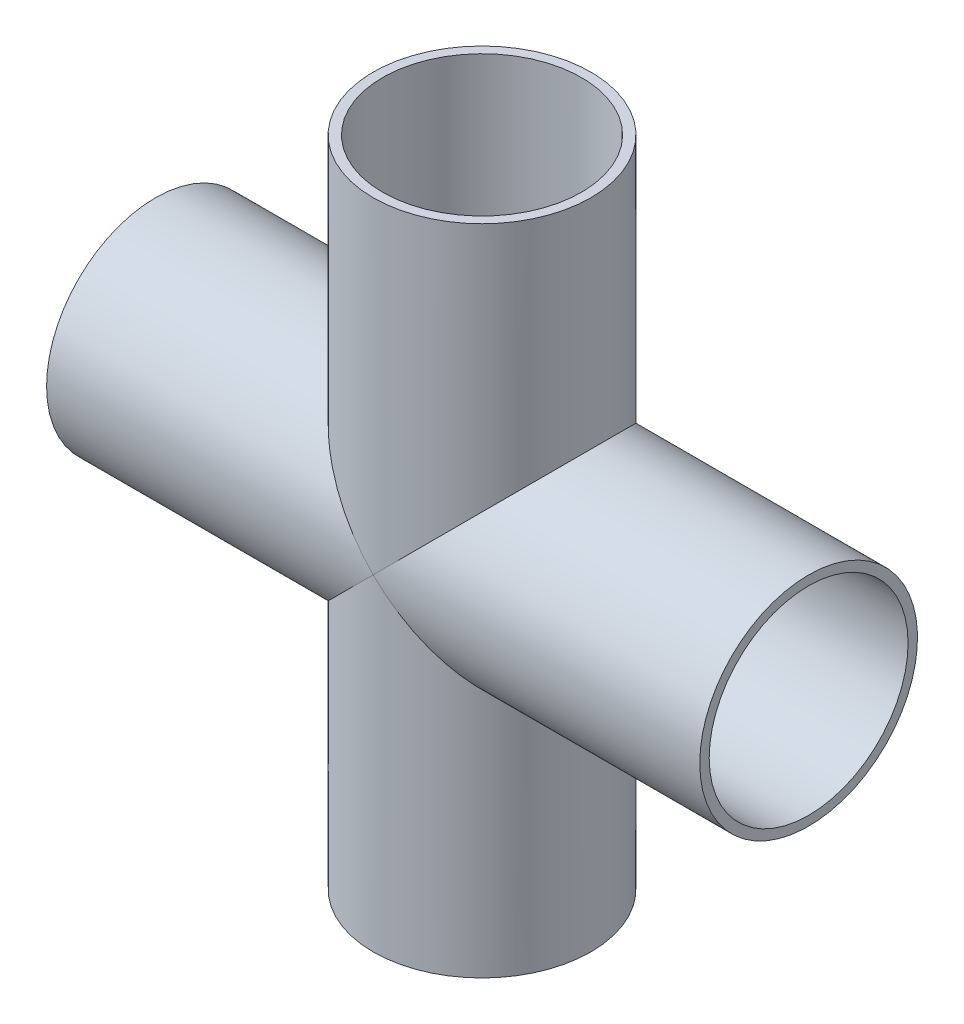
ISO-10303-21;
HEADER;
FILE_DESCRIPTION(('STEP AP214'),'2;1');
FILE_NAME('part.step','',(''),(''),'','','');
FILE_SCHEMA(('AUTOMOTIVE_DESIGN { 1 0 10303 214 1 1 1 1 }'));
ENDSEC;
DATA;
#1=APPLICATION_CONTEXT('core data for automotive mechanical design processes');
#2=APPLICATION_PROTOCOL_DEFINITION('international standard','automotive_design',2000,#1);
#3=PRODUCT_CONTEXT('',#1,'mechanical');
#4=PRODUCT('Part','Part','',(#3));
#5=PRODUCT_RELATED_PRODUCT_CATEGORY('part','',(#4));
#6=PRODUCT_DEFINITION_FORMATION('','',#4);
#7=PRODUCT_DEFINITION_CONTEXT('part definition',#1,'design');
#8=PRODUCT_DEFINITION('design','',#6,#7);
#9=PRODUCT_DEFINITION_SHAPE('','',#8);
#10=(LENGTH_UNIT() NAMED_UNIT(*) SI_UNIT(.MILLI.,.METRE.));
#11=(NAMED_UNIT(*) PLANE_ANGLE_UNIT() SI_UNIT($,.RADIAN.));
#12=(NAMED_UNIT(*) SI_UNIT($,.STERADIAN.) SOLID_ANGLE_UNIT());
#13=UNCERTAINTY_MEASURE_WITH_UNIT(LENGTH_MEASURE(1.E-05),#10,'distance_accuracy_value','');
#14=(GEOMETRIC_REPRESENTATION_CONTEXT(3) GLOBAL_UNCERTAINTY_ASSIGNED_CONTEXT((#13)) GLOBAL_UNIT_ASSIGNED_CONTEXT((#10,
#11,#12)) REPRESENTATION_CONTEXT('',''));
#15=CARTESIAN_POINT('',(0.,0.,0.));
#16=DIRECTION('',(0.,0.,1.));
#17=DIRECTION('',(1.,0.,0.));
#18=AXIS2_PLACEMENT_3D('',#15,#16,#17);
#19=CARTESIAN_POINT('',(0.,-57.15,0.));
#20=DIRECTION('',(0.,1.,0.));
#21=DIRECTION('',(1.,0.,0.));
#22=AXIS2_PLACEMENT_3D('',#19,#20,#21);
#23=PLANE('',#22);
#24=CARTESIAN_POINT('',(0.,-57.15,0.));
#25=DIRECTION('',(0.,1.,0.));
#26=DIRECTION('',(0.,0.,1.));
#27=AXIS2_PLACEMENT_3D('',#24,#25,#26);
#28=CIRCLE('',#27,17.399);
#29=CARTESIAN_POINT('',(0.,-57.15,17.399));
#30=VERTEX_POINT('',#29);
#31=EDGE_CURVE('E112',#30,#30,#28,.T.);
#32=ORIENTED_EDGE('',*,*,#31,.T.);
#33=EDGE_LOOP('',(#32));
#34=FACE_BOUND('',#33,.T.);
#35=CARTESIAN_POINT('',(0.,-57.15,0.));
#36=DIRECTION('',(0.,1.,0.));
#37=DIRECTION('',(1.,0.,0.));
#38=AXIS2_PLACEMENT_3D('',#35,#36,#37);
#39=CIRCLE('',#38,19.05);
#40=CARTESIAN_POINT('',(19.05,-57.15,0.));
#41=VERTEX_POINT('',#40);
#42=EDGE_CURVE('E136',#41,#41,#39,.T.);
#43=ORIENTED_EDGE('',*,*,#42,.F.);
#44=EDGE_LOOP('',(#43));
#45=FACE_BOUND('',#44,.T.);
#46=ADVANCED_FACE('F16',(#34,#45),#23,.F.);
#47=CARTESIAN_POINT('',(57.15,0.,0.));
#48=DIRECTION('',(-1.,0.,0.));
#49=DIRECTION('',(0.,0.,1.));
#50=AXIS2_PLACEMENT_3D('',#47,#48,#49);
#51=PLANE('',#50);
#52=CARTESIAN_POINT('',(57.15,0.,0.));
#53=DIRECTION('',(-1.,0.,0.));
#54=DIRECTION('',(0.,-1.,0.));
#55=AXIS2_PLACEMENT_3D('',#52,#53,#54);
#56=CIRCLE('',#55,17.399);
#57=CARTESIAN_POINT('',(57.15,-17.399,0.));
#58=VERTEX_POINT('',#57);
#59=EDGE_CURVE('E49',#58,#58,#56,.T.);
#60=ORIENTED_EDGE('',*,*,#59,.T.);
#61=EDGE_LOOP('',(#60));
#62=FACE_BOUND('',#61,.T.);
#63=CARTESIAN_POINT('',(57.15,0.,0.));
#64=DIRECTION('',(-1.,0.,0.));
#65=DIRECTION('',(0.,1.,0.));
#66=AXIS2_PLACEMENT_3D('',#63,#64,#65);
#67=CIRCLE('',#66,19.05);
#68=CARTESIAN_POINT('',(57.15,19.05,0.));
#69=VERTEX_POINT('',#68);
#70=EDGE_CURVE('E89',#69,#69,#67,.T.);
#71=ORIENTED_EDGE('',*,*,#70,.F.);
#72=EDGE_LOOP('',(#71));
#73=FACE_BOUND('',#72,.T.);
#74=ADVANCED_FACE('F171',(#62,#73),#51,.F.);
#75=CARTESIAN_POINT('',(0.,57.15,0.));
#76=DIRECTION('',(0.,1.,0.));
#77=DIRECTION('',(1.,0.,0.));
#78=AXIS2_PLACEMENT_3D('',#75,#76,#77);
#79=PLANE('',#78);
#80=CARTESIAN_POINT('',(0.,57.15,0.));
#81=DIRECTION('',(0.,1.,0.));
#82=DIRECTION('',(0.,0.,1.));
#83=AXIS2_PLACEMENT_3D('',#80,#81,#82);
#84=CIRCLE('',#83,17.399);
#85=CARTESIAN_POINT('',(0.,57.15,17.399));
#86=VERTEX_POINT('',#85);
#87=EDGE_CURVE('E59',#86,#86,#84,.T.);
#88=ORIENTED_EDGE('',*,*,#87,.F.);
#89=EDGE_LOOP('',(#88));
#90=FACE_BOUND('',#89,.T.);
#91=CARTESIAN_POINT('',(0.,57.15,0.));
#92=DIRECTION('',(0.,1.,0.));
#93=DIRECTION('',(1.,0.,0.));
#94=AXIS2_PLACEMENT_3D('',#91,#92,#93);
#95=CIRCLE('',#94,19.05);
#96=CARTESIAN_POINT('',(19.05,57.15,0.));
#97=VERTEX_POINT('',#96);
#98=EDGE_CURVE('E117',#97,#97,#95,.T.);
#99=ORIENTED_EDGE('',*,*,#98,.T.);
#100=EDGE_LOOP('',(#99));
#101=FACE_BOUND('',#100,.T.);
#102=ADVANCED_FACE('F18',(#90,#101),#79,.T.);
#103=CARTESIAN_POINT('',(-57.15,0.,0.));
#104=DIRECTION('',(-1.,0.,0.));
#105=DIRECTION('',(0.,0.,1.));
#106=AXIS2_PLACEMENT_3D('',#103,#104,#105);
#107=PLANE('',#106);
#108=CARTESIAN_POINT('',(-57.15,0.,0.));
#109=DIRECTION('',(-1.,0.,0.));
#110=DIRECTION('',(0.,-1.,0.));
#111=AXIS2_PLACEMENT_3D('',#108,#109,#110);
#112=CIRCLE('',#111,17.399);
#113=CARTESIAN_POINT('',(-57.15,-17.399,0.));
#114=VERTEX_POINT('',#113);
#115=EDGE_CURVE('E118',#114,#114,#112,.T.);
#116=ORIENTED_EDGE('',*,*,#115,.F.);
#117=EDGE_LOOP('',(#116));
#118=FACE_BOUND('',#117,.T.);
#119=CARTESIAN_POINT('',(-57.15,0.,0.));
#120=DIRECTION('',(-1.,0.,0.));
#121=DIRECTION('',(0.,1.,0.));
#122=AXIS2_PLACEMENT_3D('',#119,#120,#121);
#123=CIRCLE('',#122,19.05);
#124=CARTESIAN_POINT('',(-57.15,19.05,0.));
#125=VERTEX_POINT('',#124);
#126=EDGE_CURVE('E11',#125,#125,#123,.T.);
#127=ORIENTED_EDGE('',*,*,#126,.T.);
#128=EDGE_LOOP('',(#127));
#129=FACE_BOUND('',#128,.T.);
#130=ADVANCED_FACE('F221',(#118,#129),#107,.T.);
#131=CARTESIAN_POINT('',(57.15,0.,0.));
#132=DIRECTION('',(1.,0.,0.));
#133=DIRECTION('',(0.,0.,1.));
#134=AXIS2_PLACEMENT_3D('',#131,#132,#133);
#135=CYLINDRICAL_SURFACE('',#134,19.05);
#136=CARTESIAN_POINT('',(0.,0.,0.));
#137=DIRECTION('',(0.707106781186548,-0.707106781186548,0.));
#138=DIRECTION('',(-0.707106781186548,-0.707106781186548,0.));
#139=AXIS2_PLACEMENT_3D('',#136,#137,#138);
#140=ELLIPSE('',#139,26.9407683632075,19.05);
#141=CARTESIAN_POINT('',(0.,0.,19.05));
#142=VERTEX_POINT('',#141);
#143=CARTESIAN_POINT('',(0.,0.,-19.05));
#144=VERTEX_POINT('',#143);
#145=EDGE_CURVE('E26',#142,#144,#140,.T.);
#146=ORIENTED_EDGE('',*,*,#145,.F.);
#147=CARTESIAN_POINT('',(0.,0.,0.));
#148=DIRECTION('',(0.707106781186548,0.707106781186548,0.));
#149=DIRECTION('',(-0.707106781186548,0.707106781186548,0.));
#150=AXIS2_PLACEMENT_3D('',#147,#148,#149);
#151=ELLIPSE('',#150,26.9407683632075,19.05);
#152=EDGE_CURVE('E113',#144,#142,#151,.T.);
#153=ORIENTED_EDGE('',*,*,#152,.F.);
#154=EDGE_LOOP('',(#146,#153));
#155=FACE_BOUND('',#154,.T.);
#156=ORIENTED_EDGE('',*,*,#126,.F.);
#157=EDGE_LOOP('',(#156));
#158=FACE_BOUND('',#157,.T.);
#159=ADVANCED_FACE('F148',(#155,#158),#135,.T.);
#160=CARTESIAN_POINT('',(0.,-57.15,0.));
#161=DIRECTION('',(0.,-1.,0.));
#162=DIRECTION('',(0.,0.,1.));
#163=AXIS2_PLACEMENT_3D('',#160,#161,#162);
#164=CYLINDRICAL_SURFACE('',#163,19.05);
#165=CARTESIAN_POINT('',(0.,0.,0.));
#166=DIRECTION('',(-0.707106781186548,-0.707106781186548,0.));
#167=DIRECTION('',(-0.707106781186548,0.707106781186548,0.));
#168=AXIS2_PLACEMENT_3D('',#165,#166,#167);
#169=ELLIPSE('',#168,26.9407683632075,19.05);
#170=EDGE_CURVE('E99',#144,#142,#169,.T.);
#171=ORIENTED_EDGE('',*,*,#170,.T.);
#172=ORIENTED_EDGE('',*,*,#145,.T.);
#173=EDGE_LOOP('',(#171,#172));
#174=FACE_BOUND('',#173,.T.);
#175=ORIENTED_EDGE('',*,*,#42,.T.);
#176=EDGE_LOOP('',(#175));
#177=FACE_BOUND('',#176,.T.);
#178=ADVANCED_FACE('F144',(#174,#177),#164,.T.);
#179=CARTESIAN_POINT('',(0.,-57.15,0.));
#180=DIRECTION('',(0.,-1.,0.));
#181=DIRECTION('',(0.,0.,1.));
#182=AXIS2_PLACEMENT_3D('',#179,#180,#181);
#183=CYLINDRICAL_SURFACE('',#182,19.05);
#184=ORIENTED_EDGE('',*,*,#98,.F.);
#185=EDGE_LOOP('',(#184));
#186=FACE_BOUND('',#185,.T.);
#187=ORIENTED_EDGE('',*,*,#152,.T.);
#188=CARTESIAN_POINT('',(0.,0.,0.));
#189=DIRECTION('',(-0.707106781186548,0.707106781186548,0.));
#190=DIRECTION('',(-0.707106781186548,-0.707106781186548,0.));
#191=AXIS2_PLACEMENT_3D('',#188,#189,#190);
#192=ELLIPSE('',#191,26.9407683632075,19.05);
#193=EDGE_CURVE('E93',#142,#144,#192,.T.);
#194=ORIENTED_EDGE('',*,*,#193,.T.);
#195=EDGE_LOOP('',(#187,#194));
#196=FACE_BOUND('',#195,.T.);
#197=ADVANCED_FACE('F152',(#186,#196),#183,.T.);
#198=CARTESIAN_POINT('',(57.15,0.,0.));
#199=DIRECTION('',(1.,0.,0.));
#200=DIRECTION('',(0.,0.,1.));
#201=AXIS2_PLACEMENT_3D('',#198,#199,#200);
#202=CYLINDRICAL_SURFACE('',#201,17.399);
#203=CARTESIAN_POINT('',(0.,0.,0.));
#204=DIRECTION('',(0.707106781186548,-0.707106781186548,0.));
#205=DIRECTION('',(-0.707106781186548,-0.707106781186548,0.));
#206=AXIS2_PLACEMENT_3D('',#203,#204,#205);
#207=ELLIPSE('',#206,24.6059017717295,17.399);
#208=CARTESIAN_POINT('',(0.,0.,17.399));
#209=VERTEX_POINT('',#208);
#210=CARTESIAN_POINT('',(0.,0.,-17.399));
#211=VERTEX_POINT('',#210);
#212=EDGE_CURVE('E103',#209,#211,#207,.T.);
#213=ORIENTED_EDGE('',*,*,#212,.T.);
#214=CARTESIAN_POINT('',(0.,0.,0.));
#215=DIRECTION('',(0.707106781186548,0.707106781186548,0.));
#216=DIRECTION('',(-0.707106781186548,0.707106781186548,0.));
#217=AXIS2_PLACEMENT_3D('',#214,#215,#216);
#218=ELLIPSE('',#217,24.6059017717295,17.399);
#219=EDGE_CURVE('E107',#211,#209,#218,.T.);
#220=ORIENTED_EDGE('',*,*,#219,.T.);
#221=EDGE_LOOP('',(#213,#220));
#222=FACE_BOUND('',#221,.T.);
#223=ORIENTED_EDGE('',*,*,#115,.T.);
#224=EDGE_LOOP('',(#223));
#225=FACE_BOUND('',#224,.T.);
#226=ADVANCED_FACE('F154',(#222,#225),#202,.F.);
#227=CARTESIAN_POINT('',(57.15,0.,0.));
#228=DIRECTION('',(1.,0.,0.));
#229=DIRECTION('',(0.,0.,1.));
#230=AXIS2_PLACEMENT_3D('',#227,#228,#229);
#231=CYLINDRICAL_SURFACE('',#230,17.399);
#232=CARTESIAN_POINT('',(0.,0.,0.));
#233=DIRECTION('',(-0.707106781186548,0.707106781186548,0.));
#234=DIRECTION('',(-0.707106781186548,-0.707106781186548,0.));
#235=AXIS2_PLACEMENT_3D('',#232,#233,#234);
#236=ELLIPSE('',#235,24.6059017717295,17.399);
#237=EDGE_CURVE('E67',#209,#211,#236,.T.);
#238=ORIENTED_EDGE('',*,*,#237,.T.);
#239=CARTESIAN_POINT('',(0.,0.,0.));
#240=DIRECTION('',(-0.707106781186548,-0.707106781186548,0.));
#241=DIRECTION('',(-0.707106781186548,0.707106781186548,0.));
#242=AXIS2_PLACEMENT_3D('',#239,#240,#241);
#243=ELLIPSE('',#242,24.6059017717295,17.399);
#244=EDGE_CURVE('E108',#211,#209,#243,.T.);
#245=ORIENTED_EDGE('',*,*,#244,.T.);
#246=EDGE_LOOP('',(#238,#245));
#247=FACE_BOUND('',#246,.T.);
#248=ORIENTED_EDGE('',*,*,#59,.F.);
#249=EDGE_LOOP('',(#248));
#250=FACE_BOUND('',#249,.T.);
#251=ADVANCED_FACE('F163',(#247,#250),#231,.F.);
#252=CARTESIAN_POINT('',(0.,-57.15,0.));
#253=DIRECTION('',(0.,-1.,0.));
#254=DIRECTION('',(0.,0.,1.));
#255=AXIS2_PLACEMENT_3D('',#252,#253,#254);
#256=CYLINDRICAL_SURFACE('',#255,17.399);
#257=ORIENTED_EDGE('',*,*,#87,.T.);
#258=EDGE_LOOP('',(#257));
#259=FACE_BOUND('',#258,.T.);
#260=ORIENTED_EDGE('',*,*,#219,.F.);
#261=ORIENTED_EDGE('',*,*,#237,.F.);
#262=EDGE_LOOP('',(#260,#261));
#263=FACE_BOUND('',#262,.T.);
#264=ADVANCED_FACE('F183',(#259,#263),#256,.F.);
#265=CARTESIAN_POINT('',(0.,-57.15,0.));
#266=DIRECTION('',(0.,-1.,0.));
#267=DIRECTION('',(0.,0.,1.));
#268=AXIS2_PLACEMENT_3D('',#265,#266,#267);
#269=CYLINDRICAL_SURFACE('',#268,17.399);
#270=ORIENTED_EDGE('',*,*,#244,.F.);
#271=ORIENTED_EDGE('',*,*,#212,.F.);
#272=EDGE_LOOP('',(#270,#271));
#273=FACE_BOUND('',#272,.T.);
#274=ORIENTED_EDGE('',*,*,#31,.F.);
#275=EDGE_LOOP('',(#274));
#276=FACE_BOUND('',#275,.T.);
#277=ADVANCED_FACE('F181',(#273,#276),#269,.F.);
#278=CARTESIAN_POINT('',(57.15,0.,0.));
#279=DIRECTION('',(1.,0.,0.));
#280=DIRECTION('',(0.,0.,1.));
#281=AXIS2_PLACEMENT_3D('',#278,#279,#280);
#282=CYLINDRICAL_SURFACE('',#281,19.05);
#283=ORIENTED_EDGE('',*,*,#193,.F.);
#284=ORIENTED_EDGE('',*,*,#170,.F.);
#285=EDGE_LOOP('',(#283,#284));
#286=FACE_BOUND('',#285,.T.);
#287=ORIENTED_EDGE('',*,*,#70,.T.);
#288=EDGE_LOOP('',(#287));
#289=FACE_BOUND('',#288,.T.);
#290=ADVANCED_FACE('F90',(#286,#289),#282,.T.);
#291=CLOSED_SHELL('',(#46,#74,#102,#130,#159,#178,#197,#226,#251,#264,#277,#290));
#292=MANIFOLD_SOLID_BREP('B1',#291);
#293=ADVANCED_BREP_SHAPE_REPRESENTATION('',(#18,#292),#14);
#294=SHAPE_DEFINITION_REPRESENTATION(#9,#293);
ENDSEC;
END-ISO-10303-21;
